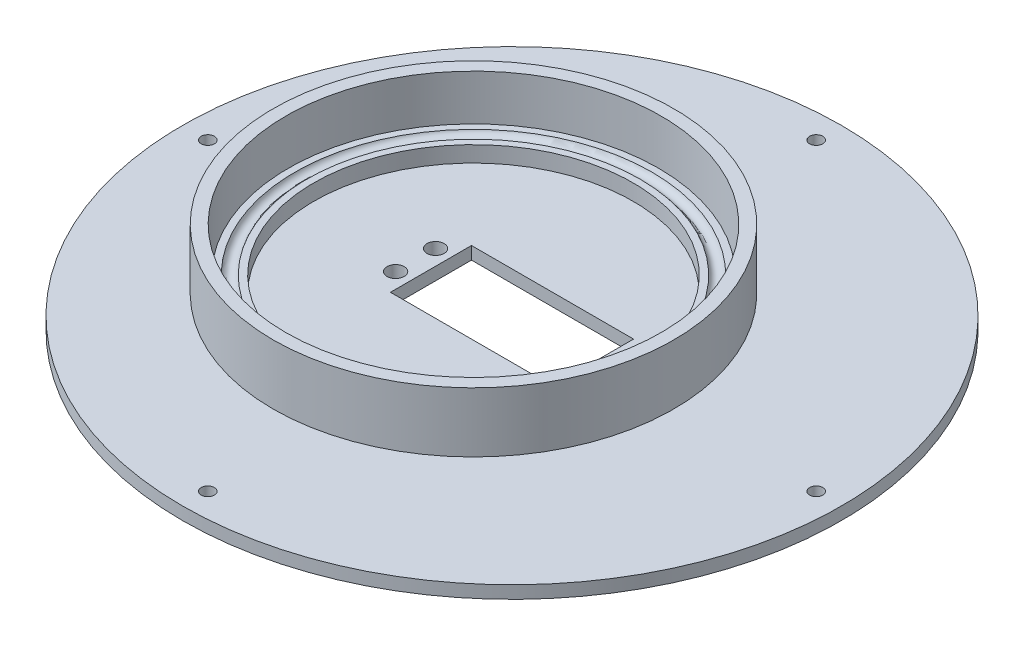
ISO-10303-21;
HEADER;
FILE_DESCRIPTION(('STEP AP214'),'2;1');
FILE_NAME('part.step','',(''),(''),'','','');
FILE_SCHEMA(('AUTOMOTIVE_DESIGN { 1 0 10303 214 1 1 1 1 }'));
ENDSEC;
DATA;
#1=APPLICATION_CONTEXT('core data for automotive mechanical design processes');
#2=APPLICATION_PROTOCOL_DEFINITION('international standard','automotive_design',2000,#1);
#3=PRODUCT_CONTEXT('',#1,'mechanical');
#4=PRODUCT('Part','Part','',(#3));
#5=PRODUCT_RELATED_PRODUCT_CATEGORY('part','',(#4));
#6=PRODUCT_DEFINITION_FORMATION('','',#4);
#7=PRODUCT_DEFINITION_CONTEXT('part definition',#1,'design');
#8=PRODUCT_DEFINITION('design','',#6,#7);
#9=PRODUCT_DEFINITION_SHAPE('','',#8);
#10=(LENGTH_UNIT() NAMED_UNIT(*) SI_UNIT(.MILLI.,.METRE.));
#11=(NAMED_UNIT(*) PLANE_ANGLE_UNIT() SI_UNIT($,.RADIAN.));
#12=(NAMED_UNIT(*) SI_UNIT($,.STERADIAN.) SOLID_ANGLE_UNIT());
#13=UNCERTAINTY_MEASURE_WITH_UNIT(LENGTH_MEASURE(1.E-05),#10,'distance_accuracy_value','');
#14=(GEOMETRIC_REPRESENTATION_CONTEXT(3) GLOBAL_UNCERTAINTY_ASSIGNED_CONTEXT((#13)) GLOBAL_UNIT_ASSIGNED_CONTEXT((#10,
#11,#12)) REPRESENTATION_CONTEXT('',''));
#15=CARTESIAN_POINT('',(0.,0.,0.));
#16=DIRECTION('',(0.,0.,1.));
#17=DIRECTION('',(1.,0.,0.));
#18=AXIS2_PLACEMENT_3D('',#15,#16,#17);
#19=CARTESIAN_POINT('',(0.,3.175,0.));
#20=DIRECTION('',(0.,1.,0.));
#21=DIRECTION('',(0.,0.,1.));
#22=AXIS2_PLACEMENT_3D('',#19,#20,#21);
#23=PLANE('',#22);
#24=CARTESIAN_POINT('',(-9.65,3.175,0.));
#25=DIRECTION('',(0.,1.,0.));
#26=DIRECTION('',(0.,0.,1.));
#27=AXIS2_PLACEMENT_3D('',#24,#25,#26);
#28=CIRCLE('',#27,46.35);
#29=CARTESIAN_POINT('',(-9.65,3.175,46.35));
#30=VERTEX_POINT('',#29);
#31=EDGE_CURVE('E153',#30,#30,#28,.T.);
#32=ORIENTED_EDGE('',*,*,#31,.F.);
#33=EDGE_LOOP('',(#32));
#34=FACE_BOUND('',#33,.T.);
#35=CARTESIAN_POINT('',(-9.65,3.175,0.));
#36=DIRECTION('',(0.,1.,0.));
#37=DIRECTION('',(0.,0.,1.));
#38=AXIS2_PLACEMENT_3D('',#35,#36,#37);
#39=CIRCLE('',#38,47.);
#40=CARTESIAN_POINT('',(-9.65,3.175,47.));
#41=VERTEX_POINT('',#40);
#42=EDGE_CURVE('E11',#41,#41,#39,.F.);
#43=ORIENTED_EDGE('',*,*,#42,.F.);
#44=EDGE_LOOP('',(#43));
#45=FACE_BOUND('',#44,.T.);
#46=ADVANCED_FACE('F39',(#34,#45),#23,.T.);
#47=CARTESIAN_POINT('',(-9.65,7.175,0.));
#48=DIRECTION('',(0.,1.,0.));
#49=DIRECTION('',(0.,0.,1.));
#50=AXIS2_PLACEMENT_3D('',#47,#48,#49);
#51=PLANE('',#50);
#52=CARTESIAN_POINT('',(-9.65,7.175,0.));
#53=DIRECTION('',(0.,1.,0.));
#54=DIRECTION('',(0.,0.,1.));
#55=AXIS2_PLACEMENT_3D('',#52,#53,#54);
#56=CIRCLE('',#55,46.35);
#57=CARTESIAN_POINT('',(-9.65,7.175,46.35));
#58=VERTEX_POINT('',#57);
#59=EDGE_CURVE('E158',#58,#58,#56,.T.);
#60=ORIENTED_EDGE('',*,*,#59,.T.);
#61=EDGE_LOOP('',(#60));
#62=FACE_BOUND('',#61,.T.);
#63=CARTESIAN_POINT('',(-9.65,7.175,0.));
#64=DIRECTION('',(0.,1.,0.));
#65=DIRECTION('',(0.,0.,1.));
#66=AXIS2_PLACEMENT_3D('',#63,#64,#65);
#67=CIRCLE('',#66,44.6817037698234);
#68=CARTESIAN_POINT('',(-9.65,7.175,44.6817037698234));
#69=VERTEX_POINT('',#68);
#70=EDGE_CURVE('E146',#69,#69,#67,.F.);
#71=ORIENTED_EDGE('',*,*,#70,.T.);
#72=EDGE_LOOP('',(#71));
#73=FACE_BOUND('',#72,.T.);
#74=ADVANCED_FACE('F222',(#62,#73),#51,.T.);
#75=CARTESIAN_POINT('',(-9.65,7.175,0.));
#76=DIRECTION('',(0.,1.,0.));
#77=DIRECTION('',(0.,0.,1.));
#78=AXIS2_PLACEMENT_3D('',#75,#76,#77);
#79=CIRCLE('',#78,40.);
#80=CARTESIAN_POINT('',(-9.65,7.175,40.));
#81=VERTEX_POINT('',#80);
#82=EDGE_CURVE('E149',#81,#81,#79,.T.);
#83=ORIENTED_EDGE('',*,*,#82,.F.);
#84=EDGE_LOOP('',(#83));
#85=FACE_BOUND('',#84,.T.);
#86=CARTESIAN_POINT('',(-9.65,7.175,0.));
#87=DIRECTION('',(0.,-1.,0.));
#88=DIRECTION('',(0.,0.,-1.));
#89=AXIS2_PLACEMENT_3D('',#86,#87,#88);
#90=CIRCLE('',#89,41.6682962301766);
#91=CARTESIAN_POINT('',(-9.65,7.175,-41.6682962301766));
#92=VERTEX_POINT('',#91);
#93=EDGE_CURVE('E144',#92,#92,#90,.F.);
#94=ORIENTED_EDGE('',*,*,#93,.T.);
#95=EDGE_LOOP('',(#94));
#96=FACE_BOUND('',#95,.T.);
#97=ADVANCED_FACE('F218',(#85,#96),#51,.T.);
#98=CARTESIAN_POINT('',(-24.15,3.175,-5.));
#99=DIRECTION('',(0.,1.,0.));
#100=DIRECTION('',(0.,0.,1.));
#101=AXIS2_PLACEMENT_3D('',#98,#99,#100);
#102=CIRCLE('',#101,2.15);
#103=CARTESIAN_POINT('',(-24.15,3.175,-2.85));
#104=VERTEX_POINT('',#103);
#105=EDGE_CURVE('E121',#104,#104,#102,.T.);
#106=ORIENTED_EDGE('',*,*,#105,.F.);
#107=EDGE_LOOP('',(#106));
#108=FACE_BOUND('',#107,.T.);
#109=DIRECTION('',(0.,0.,-1.));
#110=VECTOR('',#109,1.);
#111=CARTESIAN_POINT('',(20.3,3.175,-10.15));
#112=LINE('',#111,#110);
#113=CARTESIAN_POINT('',(20.3,3.175,10.15));
#114=VERTEX_POINT('',#113);
#115=CARTESIAN_POINT('',(20.3,3.175,-10.15));
#116=VERTEX_POINT('',#115);
#117=EDGE_CURVE('E54',#114,#116,#112,.T.);
#118=ORIENTED_EDGE('',*,*,#117,.F.);
#119=DIRECTION('',(1.,0.,0.));
#120=VECTOR('',#119,1.);
#121=CARTESIAN_POINT('',(-20.3,3.175,10.15));
#122=LINE('',#121,#120);
#123=CARTESIAN_POINT('',(-20.3,3.175,10.15));
#124=VERTEX_POINT('',#123);
#125=EDGE_CURVE('E90',#124,#114,#122,.T.);
#126=ORIENTED_EDGE('',*,*,#125,.F.);
#127=DIRECTION('',(0.,0.,1.));
#128=VECTOR('',#127,1.);
#129=CARTESIAN_POINT('',(-20.3,3.175,-10.15));
#130=LINE('',#129,#128);
#131=CARTESIAN_POINT('',(-20.3,3.175,-10.15));
#132=VERTEX_POINT('',#131);
#133=EDGE_CURVE('E95',#132,#124,#130,.T.);
#134=ORIENTED_EDGE('',*,*,#133,.F.);
#135=DIRECTION('',(-1.,0.,0.));
#136=VECTOR('',#135,1.);
#137=CARTESIAN_POINT('',(-20.3,3.175,-10.15));
#138=LINE('',#137,#136);
#139=EDGE_CURVE('E101',#116,#132,#138,.T.);
#140=ORIENTED_EDGE('',*,*,#139,.F.);
#141=EDGE_LOOP('',(#118,#126,#134,#140));
#142=FACE_BOUND('',#141,.T.);
#143=CARTESIAN_POINT('',(24.15,3.175,5.));
#144=DIRECTION('',(0.,1.,0.));
#145=DIRECTION('',(0.,0.,1.));
#146=AXIS2_PLACEMENT_3D('',#143,#144,#145);
#147=CIRCLE('',#146,2.15);
#148=CARTESIAN_POINT('',(24.15,3.175,7.15));
#149=VERTEX_POINT('',#148);
#150=EDGE_CURVE('E105',#149,#149,#147,.T.);
#151=ORIENTED_EDGE('',*,*,#150,.F.);
#152=EDGE_LOOP('',(#151));
#153=FACE_BOUND('',#152,.T.);
#154=CARTESIAN_POINT('',(24.15,3.175,-5.));
#155=DIRECTION('',(0.,1.,0.));
#156=DIRECTION('',(0.,0.,1.));
#157=AXIS2_PLACEMENT_3D('',#154,#155,#156);
#158=CIRCLE('',#157,2.15);
#159=CARTESIAN_POINT('',(24.15,3.175,-2.85));
#160=VERTEX_POINT('',#159);
#161=EDGE_CURVE('E125',#160,#160,#158,.T.);
#162=ORIENTED_EDGE('',*,*,#161,.F.);
#163=EDGE_LOOP('',(#162));
#164=FACE_BOUND('',#163,.T.);
#165=CARTESIAN_POINT('',(-24.15,3.175,5.));
#166=DIRECTION('',(0.,1.,0.));
#167=DIRECTION('',(0.,0.,1.));
#168=AXIS2_PLACEMENT_3D('',#165,#166,#167);
#169=CIRCLE('',#168,2.15);
#170=CARTESIAN_POINT('',(-24.15,3.175,7.15));
#171=VERTEX_POINT('',#170);
#172=EDGE_CURVE('E118',#171,#171,#169,.T.);
#173=ORIENTED_EDGE('',*,*,#172,.F.);
#174=EDGE_LOOP('',(#173));
#175=FACE_BOUND('',#174,.T.);
#176=CARTESIAN_POINT('',(-9.65,3.175,0.));
#177=DIRECTION('',(0.,1.,0.));
#178=DIRECTION('',(0.,0.,1.));
#179=AXIS2_PLACEMENT_3D('',#176,#177,#178);
#180=CIRCLE('',#179,40.);
#181=CARTESIAN_POINT('',(-9.65,3.175,40.));
#182=VERTEX_POINT('',#181);
#183=EDGE_CURVE('E47',#182,#182,#180,.F.);
#184=ORIENTED_EDGE('',*,*,#183,.F.);
#185=EDGE_LOOP('',(#184));
#186=FACE_BOUND('',#185,.T.);
#187=ADVANCED_FACE('F98',(#108,#142,#153,#164,#175,#186),#23,.T.);
#188=CARTESIAN_POINT('',(0.,3.175,0.));
#189=DIRECTION('',(0.,-1.,0.));
#190=DIRECTION('',(0.,0.,-1.));
#191=AXIS2_PLACEMENT_3D('',#188,#189,#190);
#192=CYLINDRICAL_SURFACE('',#191,82.55);
#193=CARTESIAN_POINT('',(0.,3.175,0.));
#194=DIRECTION('',(0.,1.,0.));
#195=DIRECTION('',(0.,0.,1.));
#196=AXIS2_PLACEMENT_3D('',#193,#194,#195);
#197=CIRCLE('',#196,82.55);
#198=CARTESIAN_POINT('',(0.,3.175,82.55));
#199=VERTEX_POINT('',#198);
#200=EDGE_CURVE('E137',#199,#199,#197,.T.);
#201=ORIENTED_EDGE('',*,*,#200,.F.);
#202=EDGE_LOOP('',(#201));
#203=FACE_BOUND('',#202,.T.);
#204=CARTESIAN_POINT('',(0.,0.,0.));
#205=DIRECTION('',(0.,1.,0.));
#206=DIRECTION('',(0.,0.,1.));
#207=AXIS2_PLACEMENT_3D('',#204,#205,#206);
#208=CIRCLE('',#207,82.55);
#209=CARTESIAN_POINT('',(0.,0.,82.55));
#210=VERTEX_POINT('',#209);
#211=EDGE_CURVE('E134',#210,#210,#208,.T.);
#212=ORIENTED_EDGE('',*,*,#211,.T.);
#213=EDGE_LOOP('',(#212));
#214=FACE_BOUND('',#213,.T.);
#215=ADVANCED_FACE('F41',(#203,#214),#192,.T.);
#216=CARTESIAN_POINT('',(-9.65,3.175,0.));
#217=DIRECTION('',(0.,1.,0.));
#218=DIRECTION('',(0.,0.,1.));
#219=AXIS2_PLACEMENT_3D('',#216,#217,#218);
#220=CIRCLE('',#219,50.175);
#221=CARTESIAN_POINT('',(-9.65,3.175,50.175));
#222=VERTEX_POINT('',#221);
#223=EDGE_CURVE('E162',#222,#222,#220,.T.);
#224=ORIENTED_EDGE('',*,*,#223,.F.);
#225=EDGE_LOOP('',(#224));
#226=FACE_BOUND('',#225,.T.);
#227=CARTESIAN_POINT('',(2.7538268662935E-13,3.175,76.2));
#228=DIRECTION('',(0.,1.,0.));
#229=DIRECTION('',(1.,0.,0.));
#230=AXIS2_PLACEMENT_3D('',#227,#228,#229);
#231=CIRCLE('',#230,1.65);
#232=CARTESIAN_POINT('',(1.65000000000028,3.175,76.2));
#233=VERTEX_POINT('',#232);
#234=EDGE_CURVE('E171',#233,#233,#231,.T.);
#235=ORIENTED_EDGE('',*,*,#234,.F.);
#236=EDGE_LOOP('',(#235));
#237=FACE_BOUND('',#236,.T.);
#238=CARTESIAN_POINT('',(76.2,3.175,0.));
#239=DIRECTION('',(0.,1.,0.));
#240=DIRECTION('',(0.,0.,-1.));
#241=AXIS2_PLACEMENT_3D('',#238,#239,#240);
#242=CIRCLE('',#241,1.65);
#243=CARTESIAN_POINT('',(76.2,3.175,-1.65000000000001));
#244=VERTEX_POINT('',#243);
#245=EDGE_CURVE('E177',#244,#244,#242,.T.);
#246=ORIENTED_EDGE('',*,*,#245,.F.);
#247=EDGE_LOOP('',(#246));
#248=FACE_BOUND('',#247,.T.);
#249=CARTESIAN_POINT('',(-8.07484442669043E-13,3.175,-76.2));
#250=DIRECTION('',(0.,1.,0.));
#251=DIRECTION('',(-1.,0.,0.));
#252=AXIS2_PLACEMENT_3D('',#249,#250,#251);
#253=CIRCLE('',#252,1.65);
#254=CARTESIAN_POINT('',(-1.65000000000081,3.175,-76.2));
#255=VERTEX_POINT('',#254);
#256=EDGE_CURVE('E165',#255,#255,#253,.T.);
#257=ORIENTED_EDGE('',*,*,#256,.F.);
#258=EDGE_LOOP('',(#257));
#259=FACE_BOUND('',#258,.T.);
#260=CARTESIAN_POINT('',(-76.2,3.175,0.));
#261=DIRECTION('',(0.,1.,0.));
#262=DIRECTION('',(0.,0.,1.));
#263=AXIS2_PLACEMENT_3D('',#260,#261,#262);
#264=CIRCLE('',#263,1.65);
#265=CARTESIAN_POINT('',(-76.2,3.175,1.65000000000001));
#266=VERTEX_POINT('',#265);
#267=EDGE_CURVE('E170',#266,#266,#264,.T.);
#268=ORIENTED_EDGE('',*,*,#267,.F.);
#269=EDGE_LOOP('',(#268));
#270=FACE_BOUND('',#269,.T.);
#271=ORIENTED_EDGE('',*,*,#200,.T.);
#272=EDGE_LOOP('',(#271));
#273=FACE_BOUND('',#272,.T.);
#274=ADVANCED_FACE('F203',(#226,#237,#248,#259,#270,#273),#23,.T.);
#275=CARTESIAN_POINT('',(0.,0.,0.));
#276=DIRECTION('',(0.,1.,0.));
#277=DIRECTION('',(0.,0.,1.));
#278=AXIS2_PLACEMENT_3D('',#275,#276,#277);
#279=PLANE('',#278);
#280=CARTESIAN_POINT('',(2.7538268662935E-13,0.,76.2));
#281=DIRECTION('',(0.,1.,0.));
#282=DIRECTION('',(1.,0.,0.));
#283=AXIS2_PLACEMENT_3D('',#280,#281,#282);
#284=CIRCLE('',#283,1.65);
#285=CARTESIAN_POINT('',(1.65000000000028,0.,76.2));
#286=VERTEX_POINT('',#285);
#287=EDGE_CURVE('E167',#286,#286,#284,.T.);
#288=ORIENTED_EDGE('',*,*,#287,.T.);
#289=EDGE_LOOP('',(#288));
#290=FACE_BOUND('',#289,.T.);
#291=CARTESIAN_POINT('',(76.2,0.,0.));
#292=DIRECTION('',(0.,1.,0.));
#293=DIRECTION('',(0.,0.,-1.));
#294=AXIS2_PLACEMENT_3D('',#291,#292,#293);
#295=CIRCLE('',#294,1.65);
#296=CARTESIAN_POINT('',(76.2,0.,-1.65000000000001));
#297=VERTEX_POINT('',#296);
#298=EDGE_CURVE('E174',#297,#297,#295,.T.);
#299=ORIENTED_EDGE('',*,*,#298,.T.);
#300=EDGE_LOOP('',(#299));
#301=FACE_BOUND('',#300,.T.);
#302=CARTESIAN_POINT('',(-8.07484442669043E-13,0.,-76.2));
#303=DIRECTION('',(0.,1.,0.));
#304=DIRECTION('',(-1.,0.,0.));
#305=AXIS2_PLACEMENT_3D('',#302,#303,#304);
#306=CIRCLE('',#305,1.65);
#307=CARTESIAN_POINT('',(-1.65000000000081,0.,-76.2));
#308=VERTEX_POINT('',#307);
#309=EDGE_CURVE('E180',#308,#308,#306,.T.);
#310=ORIENTED_EDGE('',*,*,#309,.T.);
#311=EDGE_LOOP('',(#310));
#312=FACE_BOUND('',#311,.T.);
#313=CARTESIAN_POINT('',(-76.2,0.,0.));
#314=DIRECTION('',(0.,1.,0.));
#315=DIRECTION('',(0.,0.,1.));
#316=AXIS2_PLACEMENT_3D('',#313,#314,#315);
#317=CIRCLE('',#316,1.65);
#318=CARTESIAN_POINT('',(-76.2,0.,1.65000000000001));
#319=VERTEX_POINT('',#318);
#320=EDGE_CURVE('E87',#319,#319,#317,.T.);
#321=ORIENTED_EDGE('',*,*,#320,.T.);
#322=EDGE_LOOP('',(#321));
#323=FACE_BOUND('',#322,.T.);
#324=CARTESIAN_POINT('',(-24.15,0.,5.));
#325=DIRECTION('',(0.,1.,0.));
#326=DIRECTION('',(0.,0.,1.));
#327=AXIS2_PLACEMENT_3D('',#324,#325,#326);
#328=CIRCLE('',#327,2.15);
#329=CARTESIAN_POINT('',(-24.15,0.,7.15));
#330=VERTEX_POINT('',#329);
#331=EDGE_CURVE('E122',#330,#330,#328,.T.);
#332=ORIENTED_EDGE('',*,*,#331,.T.);
#333=EDGE_LOOP('',(#332));
#334=FACE_BOUND('',#333,.T.);
#335=CARTESIAN_POINT('',(24.15,0.,-5.));
#336=DIRECTION('',(0.,1.,0.));
#337=DIRECTION('',(0.,0.,1.));
#338=AXIS2_PLACEMENT_3D('',#335,#336,#337);
#339=CIRCLE('',#338,2.15);
#340=CARTESIAN_POINT('',(24.15,0.,-2.85));
#341=VERTEX_POINT('',#340);
#342=EDGE_CURVE('E128',#341,#341,#339,.T.);
#343=ORIENTED_EDGE('',*,*,#342,.T.);
#344=EDGE_LOOP('',(#343));
#345=FACE_BOUND('',#344,.T.);
#346=CARTESIAN_POINT('',(24.15,0.,5.));
#347=DIRECTION('',(0.,1.,0.));
#348=DIRECTION('',(0.,0.,1.));
#349=AXIS2_PLACEMENT_3D('',#346,#347,#348);
#350=CIRCLE('',#349,2.15);
#351=CARTESIAN_POINT('',(24.15,0.,7.15));
#352=VERTEX_POINT('',#351);
#353=EDGE_CURVE('E102',#352,#352,#350,.T.);
#354=ORIENTED_EDGE('',*,*,#353,.T.);
#355=EDGE_LOOP('',(#354));
#356=FACE_BOUND('',#355,.T.);
#357=DIRECTION('',(1.,0.,0.));
#358=VECTOR('',#357,1.);
#359=CARTESIAN_POINT('',(-20.3,0.,10.15));
#360=LINE('',#359,#358);
#361=CARTESIAN_POINT('',(-20.3,0.,10.15));
#362=VERTEX_POINT('',#361);
#363=CARTESIAN_POINT('',(20.3,0.,10.15));
#364=VERTEX_POINT('',#363);
#365=EDGE_CURVE('E110',#362,#364,#360,.T.);
#366=ORIENTED_EDGE('',*,*,#365,.T.);
#367=DIRECTION('',(0.,0.,-1.));
#368=VECTOR('',#367,1.);
#369=CARTESIAN_POINT('',(20.3,0.,-10.15));
#370=LINE('',#369,#368);
#371=CARTESIAN_POINT('',(20.3,0.,-10.15));
#372=VERTEX_POINT('',#371);
#373=EDGE_CURVE('E82',#364,#372,#370,.T.);
#374=ORIENTED_EDGE('',*,*,#373,.T.);
#375=DIRECTION('',(-1.,0.,0.));
#376=VECTOR('',#375,1.);
#377=CARTESIAN_POINT('',(-20.3,0.,-10.15));
#378=LINE('',#377,#376);
#379=CARTESIAN_POINT('',(-20.3,0.,-10.15));
#380=VERTEX_POINT('',#379);
#381=EDGE_CURVE('E114',#372,#380,#378,.T.);
#382=ORIENTED_EDGE('',*,*,#381,.T.);
#383=DIRECTION('',(0.,0.,1.));
#384=VECTOR('',#383,1.);
#385=CARTESIAN_POINT('',(-20.3,0.,-10.15));
#386=LINE('',#385,#384);
#387=EDGE_CURVE('E62',#380,#362,#386,.T.);
#388=ORIENTED_EDGE('',*,*,#387,.T.);
#389=EDGE_LOOP('',(#366,#374,#382,#388));
#390=FACE_BOUND('',#389,.T.);
#391=CARTESIAN_POINT('',(-24.15,0.,-5.));
#392=DIRECTION('',(0.,1.,0.));
#393=DIRECTION('',(0.,0.,1.));
#394=AXIS2_PLACEMENT_3D('',#391,#392,#393);
#395=CIRCLE('',#394,2.15);
#396=CARTESIAN_POINT('',(-24.15,0.,-2.85));
#397=VERTEX_POINT('',#396);
#398=EDGE_CURVE('E131',#397,#397,#395,.T.);
#399=ORIENTED_EDGE('',*,*,#398,.T.);
#400=EDGE_LOOP('',(#399));
#401=FACE_BOUND('',#400,.T.);
#402=ORIENTED_EDGE('',*,*,#211,.F.);
#403=EDGE_LOOP('',(#402));
#404=FACE_BOUND('',#403,.T.);
#405=ADVANCED_FACE('F199',(#290,#301,#312,#323,#334,#345,#356,#390,#401,#404),#279,.F.);
#406=CARTESIAN_POINT('',(-24.15,0.,-5.));
#407=DIRECTION('',(0.,1.,0.));
#408=DIRECTION('',(0.,0.,1.));
#409=AXIS2_PLACEMENT_3D('',#406,#407,#408);
#410=CYLINDRICAL_SURFACE('',#409,2.15);
#411=ORIENTED_EDGE('',*,*,#398,.F.);
#412=EDGE_LOOP('',(#411));
#413=FACE_BOUND('',#412,.T.);
#414=ORIENTED_EDGE('',*,*,#105,.T.);
#415=EDGE_LOOP('',(#414));
#416=FACE_BOUND('',#415,.T.);
#417=ADVANCED_FACE('F202',(#413,#416),#410,.F.);
#418=CARTESIAN_POINT('',(20.3,0.,-10.15));
#419=DIRECTION('',(1.,0.,0.));
#420=DIRECTION('',(0.,0.,-1.));
#421=AXIS2_PLACEMENT_3D('',#418,#419,#420);
#422=PLANE('',#421);
#423=ORIENTED_EDGE('',*,*,#117,.T.);
#424=DIRECTION('',(0.,1.,0.));
#425=VECTOR('',#424,1.);
#426=CARTESIAN_POINT('',(20.3,0.,-10.15));
#427=LINE('',#426,#425);
#428=EDGE_CURVE('E112',#372,#116,#427,.T.);
#429=ORIENTED_EDGE('',*,*,#428,.F.);
#430=ORIENTED_EDGE('',*,*,#373,.F.);
#431=DIRECTION('',(0.,1.,0.));
#432=VECTOR('',#431,1.);
#433=CARTESIAN_POINT('',(20.3,0.,10.15));
#434=LINE('',#433,#432);
#435=EDGE_CURVE('E78',#364,#114,#434,.T.);
#436=ORIENTED_EDGE('',*,*,#435,.T.);
#437=EDGE_LOOP('',(#423,#429,#430,#436));
#438=FACE_BOUND('',#437,.T.);
#439=ADVANCED_FACE('F80',(#438),#422,.F.);
#440=CARTESIAN_POINT('',(-20.3,0.,10.15));
#441=DIRECTION('',(0.,0.,1.));
#442=DIRECTION('',(1.,0.,0.));
#443=AXIS2_PLACEMENT_3D('',#440,#441,#442);
#444=PLANE('',#443);
#445=ORIENTED_EDGE('',*,*,#125,.T.);
#446=ORIENTED_EDGE('',*,*,#435,.F.);
#447=ORIENTED_EDGE('',*,*,#365,.F.);
#448=DIRECTION('',(0.,1.,0.));
#449=VECTOR('',#448,1.);
#450=CARTESIAN_POINT('',(-20.3,0.,10.15));
#451=LINE('',#450,#449);
#452=EDGE_CURVE('E86',#362,#124,#451,.T.);
#453=ORIENTED_EDGE('',*,*,#452,.T.);
#454=EDGE_LOOP('',(#445,#446,#447,#453));
#455=FACE_BOUND('',#454,.T.);
#456=ADVANCED_FACE('F91',(#455),#444,.F.);
#457=CARTESIAN_POINT('',(-20.3,0.,-10.15));
#458=DIRECTION('',(-1.,0.,0.));
#459=DIRECTION('',(0.,0.,1.));
#460=AXIS2_PLACEMENT_3D('',#457,#458,#459);
#461=PLANE('',#460);
#462=ORIENTED_EDGE('',*,*,#133,.T.);
#463=ORIENTED_EDGE('',*,*,#452,.F.);
#464=ORIENTED_EDGE('',*,*,#387,.F.);
#465=DIRECTION('',(0.,1.,0.));
#466=VECTOR('',#465,1.);
#467=CARTESIAN_POINT('',(-20.3,0.,-10.15));
#468=LINE('',#467,#466);
#469=EDGE_CURVE('E192',#380,#132,#468,.T.);
#470=ORIENTED_EDGE('',*,*,#469,.T.);
#471=EDGE_LOOP('',(#462,#463,#464,#470));
#472=FACE_BOUND('',#471,.T.);
#473=ADVANCED_FACE('F194',(#472),#461,.F.);
#474=CARTESIAN_POINT('',(-20.3,0.,-10.15));
#475=DIRECTION('',(0.,0.,-1.));
#476=DIRECTION('',(-1.,0.,0.));
#477=AXIS2_PLACEMENT_3D('',#474,#475,#476);
#478=PLANE('',#477);
#479=ORIENTED_EDGE('',*,*,#139,.T.);
#480=ORIENTED_EDGE('',*,*,#469,.F.);
#481=ORIENTED_EDGE('',*,*,#381,.F.);
#482=ORIENTED_EDGE('',*,*,#428,.T.);
#483=EDGE_LOOP('',(#479,#480,#481,#482));
#484=FACE_BOUND('',#483,.T.);
#485=ADVANCED_FACE('F197',(#484),#478,.F.);
#486=CARTESIAN_POINT('',(24.15,0.,5.));
#487=DIRECTION('',(0.,1.,0.));
#488=DIRECTION('',(0.,0.,1.));
#489=AXIS2_PLACEMENT_3D('',#486,#487,#488);
#490=CYLINDRICAL_SURFACE('',#489,2.15);
#491=ORIENTED_EDGE('',*,*,#353,.F.);
#492=EDGE_LOOP('',(#491));
#493=FACE_BOUND('',#492,.T.);
#494=ORIENTED_EDGE('',*,*,#150,.T.);
#495=EDGE_LOOP('',(#494));
#496=FACE_BOUND('',#495,.T.);
#497=ADVANCED_FACE('F239',(#493,#496),#490,.F.);
#498=CARTESIAN_POINT('',(24.15,0.,-5.));
#499=DIRECTION('',(0.,1.,0.));
#500=DIRECTION('',(0.,0.,1.));
#501=AXIS2_PLACEMENT_3D('',#498,#499,#500);
#502=CYLINDRICAL_SURFACE('',#501,2.15);
#503=ORIENTED_EDGE('',*,*,#342,.F.);
#504=EDGE_LOOP('',(#503));
#505=FACE_BOUND('',#504,.T.);
#506=ORIENTED_EDGE('',*,*,#161,.T.);
#507=EDGE_LOOP('',(#506));
#508=FACE_BOUND('',#507,.T.);
#509=ADVANCED_FACE('F235',(#505,#508),#502,.F.);
#510=CARTESIAN_POINT('',(-24.15,0.,5.));
#511=DIRECTION('',(0.,1.,0.));
#512=DIRECTION('',(0.,0.,1.));
#513=AXIS2_PLACEMENT_3D('',#510,#511,#512);
#514=CYLINDRICAL_SURFACE('',#513,2.15);
#515=ORIENTED_EDGE('',*,*,#331,.F.);
#516=EDGE_LOOP('',(#515));
#517=FACE_BOUND('',#516,.T.);
#518=ORIENTED_EDGE('',*,*,#172,.T.);
#519=EDGE_LOOP('',(#518));
#520=FACE_BOUND('',#519,.T.);
#521=ADVANCED_FACE('F238',(#517,#520),#514,.F.);
#522=CARTESIAN_POINT('',(-76.2,0.,0.));
#523=DIRECTION('',(0.,1.,0.));
#524=DIRECTION('',(0.,0.,1.));
#525=AXIS2_PLACEMENT_3D('',#522,#523,#524);
#526=CYLINDRICAL_SURFACE('',#525,1.65);
#527=ORIENTED_EDGE('',*,*,#320,.F.);
#528=EDGE_LOOP('',(#527));
#529=FACE_BOUND('',#528,.T.);
#530=ORIENTED_EDGE('',*,*,#267,.T.);
#531=EDGE_LOOP('',(#530));
#532=FACE_BOUND('',#531,.T.);
#533=ADVANCED_FACE('F243',(#529,#532),#526,.F.);
#534=CARTESIAN_POINT('',(-8.07484442669043E-13,0.,-76.2));
#535=DIRECTION('',(0.,1.,0.));
#536=DIRECTION('',(0.,0.,1.));
#537=AXIS2_PLACEMENT_3D('',#534,#535,#536);
#538=CYLINDRICAL_SURFACE('',#537,1.65);
#539=ORIENTED_EDGE('',*,*,#309,.F.);
#540=EDGE_LOOP('',(#539));
#541=FACE_BOUND('',#540,.T.);
#542=ORIENTED_EDGE('',*,*,#256,.T.);
#543=EDGE_LOOP('',(#542));
#544=FACE_BOUND('',#543,.T.);
#545=ADVANCED_FACE('F258',(#541,#544),#538,.F.);
#546=CARTESIAN_POINT('',(76.2,0.,0.));
#547=DIRECTION('',(0.,1.,0.));
#548=DIRECTION('',(0.,0.,1.));
#549=AXIS2_PLACEMENT_3D('',#546,#547,#548);
#550=CYLINDRICAL_SURFACE('',#549,1.65);
#551=ORIENTED_EDGE('',*,*,#298,.F.);
#552=EDGE_LOOP('',(#551));
#553=FACE_BOUND('',#552,.T.);
#554=ORIENTED_EDGE('',*,*,#245,.T.);
#555=EDGE_LOOP('',(#554));
#556=FACE_BOUND('',#555,.T.);
#557=ADVANCED_FACE('F262',(#553,#556),#550,.F.);
#558=CARTESIAN_POINT('',(2.7538268662935E-13,0.,76.2));
#559=DIRECTION('',(0.,1.,0.));
#560=DIRECTION('',(0.,0.,1.));
#561=AXIS2_PLACEMENT_3D('',#558,#559,#560);
#562=CYLINDRICAL_SURFACE('',#561,1.65);
#563=ORIENTED_EDGE('',*,*,#287,.F.);
#564=EDGE_LOOP('',(#563));
#565=FACE_BOUND('',#564,.T.);
#566=ORIENTED_EDGE('',*,*,#234,.T.);
#567=EDGE_LOOP('',(#566));
#568=FACE_BOUND('',#567,.T.);
#569=ADVANCED_FACE('F266',(#565,#568),#562,.F.);
#570=CARTESIAN_POINT('',(-9.65,7.175,0.));
#571=DIRECTION('',(0.,-1.,0.));
#572=DIRECTION('',(0.,0.,-1.));
#573=AXIS2_PLACEMENT_3D('',#570,#571,#572);
#574=CYLINDRICAL_SURFACE('',#573,46.35);
#575=ORIENTED_EDGE('',*,*,#59,.F.);
#576=EDGE_LOOP('',(#575));
#577=FACE_BOUND('',#576,.T.);
#578=ORIENTED_EDGE('',*,*,#31,.T.);
#579=EDGE_LOOP('',(#578));
#580=FACE_BOUND('',#579,.T.);
#581=ADVANCED_FACE('F270',(#577,#580),#574,.T.);
#582=CARTESIAN_POINT('',(-9.65,7.175,0.));
#583=DIRECTION('',(0.,-1.,0.));
#584=DIRECTION('',(0.,0.,-1.));
#585=AXIS2_PLACEMENT_3D('',#582,#583,#584);
#586=CYLINDRICAL_SURFACE('',#585,40.);
#587=ORIENTED_EDGE('',*,*,#82,.T.);
#588=EDGE_LOOP('',(#587));
#589=FACE_BOUND('',#588,.T.);
#590=ORIENTED_EDGE('',*,*,#183,.T.);
#591=EDGE_LOOP('',(#590));
#592=FACE_BOUND('',#591,.T.);
#593=ADVANCED_FACE('F273',(#589,#592),#586,.F.);
#594=CARTESIAN_POINT('',(-9.65,7.675,0.));
#595=DIRECTION('',(0.,-1.,0.));
#596=DIRECTION('',(0.,0.,-1.));
#597=AXIS2_PLACEMENT_3D('',#594,#595,#596);
#598=TOROIDAL_SURFACE('',#597,43.175,1.5875);
#599=ORIENTED_EDGE('',*,*,#70,.F.);
#600=EDGE_LOOP('',(#599));
#601=FACE_BOUND('',#600,.T.);
#602=ORIENTED_EDGE('',*,*,#93,.F.);
#603=EDGE_LOOP('',(#602));
#604=FACE_BOUND('',#603,.T.);
#605=ADVANCED_FACE('F278',(#601,#604),#598,.F.);
#606=CARTESIAN_POINT('',(-9.65,18.175,0.));
#607=DIRECTION('',(0.,1.,0.));
#608=DIRECTION('',(0.,0.,1.));
#609=AXIS2_PLACEMENT_3D('',#606,#607,#608);
#610=PLANE('',#609);
#611=CARTESIAN_POINT('',(-9.65,18.175,0.));
#612=DIRECTION('',(0.,1.,0.));
#613=DIRECTION('',(0.,0.,1.));
#614=AXIS2_PLACEMENT_3D('',#611,#612,#613);
#615=CIRCLE('',#614,50.175);
#616=CARTESIAN_POINT('',(-9.65,18.175,50.175));
#617=VERTEX_POINT('',#616);
#618=EDGE_CURVE('E147',#617,#617,#615,.T.);
#619=ORIENTED_EDGE('',*,*,#618,.T.);
#620=EDGE_LOOP('',(#619));
#621=FACE_BOUND('',#620,.T.);
#622=CARTESIAN_POINT('',(-9.65,18.175,0.));
#623=DIRECTION('',(0.,1.,0.));
#624=DIRECTION('',(0.,0.,1.));
#625=AXIS2_PLACEMENT_3D('',#622,#623,#624);
#626=CIRCLE('',#625,47.);
#627=CARTESIAN_POINT('',(-9.65,18.175,47.));
#628=VERTEX_POINT('',#627);
#629=EDGE_CURVE('E297',#628,#628,#626,.T.);
#630=ORIENTED_EDGE('',*,*,#629,.F.);
#631=EDGE_LOOP('',(#630));
#632=FACE_BOUND('',#631,.T.);
#633=ADVANCED_FACE('F280',(#621,#632),#610,.T.);
#634=CARTESIAN_POINT('',(-9.65,18.175,0.));
#635=DIRECTION('',(0.,-1.,0.));
#636=DIRECTION('',(0.,0.,-1.));
#637=AXIS2_PLACEMENT_3D('',#634,#635,#636);
#638=CYLINDRICAL_SURFACE('',#637,50.175);
#639=ORIENTED_EDGE('',*,*,#618,.F.);
#640=EDGE_LOOP('',(#639));
#641=FACE_BOUND('',#640,.T.);
#642=ORIENTED_EDGE('',*,*,#223,.T.);
#643=EDGE_LOOP('',(#642));
#644=FACE_BOUND('',#643,.T.);
#645=ADVANCED_FACE('F282',(#641,#644),#638,.T.);
#646=CARTESIAN_POINT('',(-9.65,18.175,0.));
#647=DIRECTION('',(0.,-1.,0.));
#648=DIRECTION('',(0.,0.,-1.));
#649=AXIS2_PLACEMENT_3D('',#646,#647,#648);
#650=CYLINDRICAL_SURFACE('',#649,47.);
#651=ORIENTED_EDGE('',*,*,#629,.T.);
#652=EDGE_LOOP('',(#651));
#653=FACE_BOUND('',#652,.T.);
#654=ORIENTED_EDGE('',*,*,#42,.T.);
#655=EDGE_LOOP('',(#654));
#656=FACE_BOUND('',#655,.T.);
#657=ADVANCED_FACE('F285',(#653,#656),#650,.F.);
#658=CLOSED_SHELL('',(#46,#74,#97,#187,#215,#274,#405,#417,#439,#456,#473,#485,#497,#509,#521,
#533,#545,#557,#569,#581,#593,#605,#633,#645,#657));
#659=MANIFOLD_SOLID_BREP('B2',#658);
#660=ADVANCED_BREP_SHAPE_REPRESENTATION('',(#18,#659),#14);
#661=SHAPE_DEFINITION_REPRESENTATION(#9,#660);
ENDSEC;
END-ISO-10303-21;
